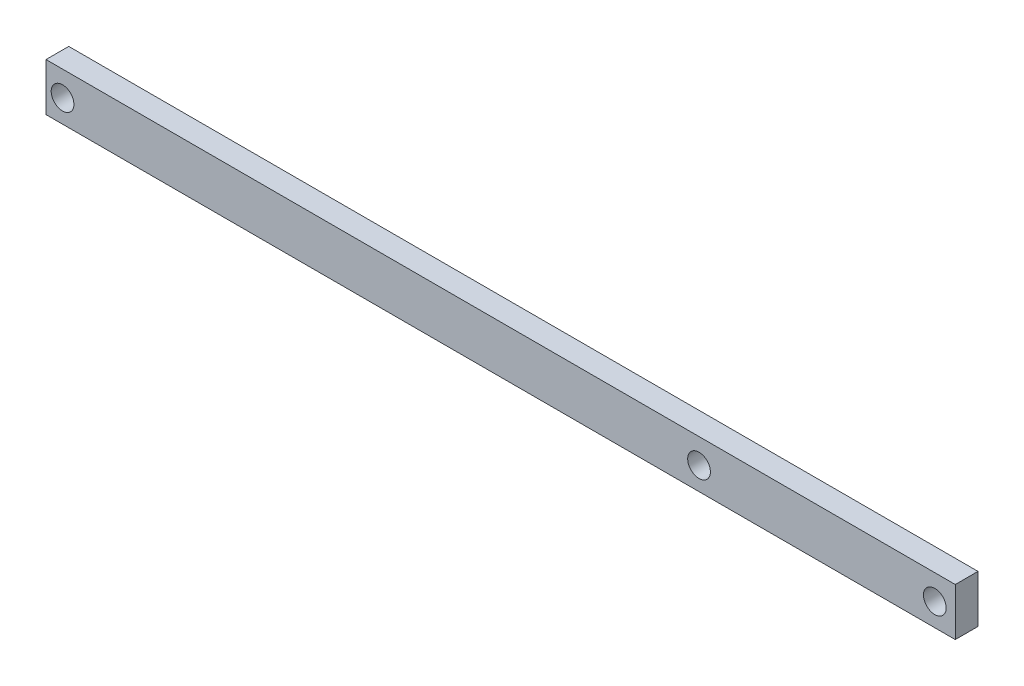
ISO-10303-21;
HEADER;
FILE_DESCRIPTION(('STEP AP214'),'2;1');
FILE_NAME('part.step','',(''),(''),'','','');
FILE_SCHEMA(('AUTOMOTIVE_DESIGN { 1 0 10303 214 1 1 1 1 }'));
ENDSEC;
DATA;
#1=APPLICATION_CONTEXT('core data for automotive mechanical design processes');
#2=APPLICATION_PROTOCOL_DEFINITION('international standard','automotive_design',2000,#1);
#3=PRODUCT_CONTEXT('',#1,'mechanical');
#4=PRODUCT('Part','Part','',(#3));
#5=PRODUCT_RELATED_PRODUCT_CATEGORY('part','',(#4));
#6=PRODUCT_DEFINITION_FORMATION('','',#4);
#7=PRODUCT_DEFINITION_CONTEXT('part definition',#1,'design');
#8=PRODUCT_DEFINITION('design','',#6,#7);
#9=PRODUCT_DEFINITION_SHAPE('','',#8);
#10=(LENGTH_UNIT() NAMED_UNIT(*) SI_UNIT(.MILLI.,.METRE.));
#11=(NAMED_UNIT(*) PLANE_ANGLE_UNIT() SI_UNIT($,.RADIAN.));
#12=(NAMED_UNIT(*) SI_UNIT($,.STERADIAN.) SOLID_ANGLE_UNIT());
#13=UNCERTAINTY_MEASURE_WITH_UNIT(LENGTH_MEASURE(1.E-05),#10,'distance_accuracy_value','');
#14=(GEOMETRIC_REPRESENTATION_CONTEXT(3) GLOBAL_UNCERTAINTY_ASSIGNED_CONTEXT((#13)) GLOBAL_UNIT_ASSIGNED_CONTEXT((#10,
#11,#12)) REPRESENTATION_CONTEXT('',''));
#15=CARTESIAN_POINT('',(0.,0.,0.));
#16=DIRECTION('',(0.,0.,1.));
#17=DIRECTION('',(1.,0.,0.));
#18=AXIS2_PLACEMENT_3D('',#15,#16,#17);
#19=CARTESIAN_POINT('',(0.,0.,10.));
#20=DIRECTION('',(0.,0.,1.));
#21=DIRECTION('',(1.,0.,0.));
#22=AXIS2_PLACEMENT_3D('',#19,#20,#21);
#23=PLANE('',#22);
#24=CARTESIAN_POINT('',(170.979738893048,-2.32108985258689,10.));
#25=DIRECTION('',(0.,0.,1.));
#26=DIRECTION('',(1.,0.,0.));
#27=AXIS2_PLACEMENT_3D('',#24,#25,#26);
#28=CIRCLE('',#27,4.99999999999999);
#29=CARTESIAN_POINT('',(175.979738893048,-2.32108985258689,10.));
#30=VERTEX_POINT('',#29);
#31=EDGE_CURVE('E121',#30,#30,#28,.T.);
#32=ORIENTED_EDGE('',*,*,#31,.F.);
#33=EDGE_LOOP('',(#32));
#34=FACE_BOUND('',#33,.T.);
#35=DIRECTION('',(0.,-1.,0.));
#36=VECTOR('',#35,1.);
#37=CARTESIAN_POINT('',(-116.30017452007,8.65437632415788,10.));
#38=LINE('',#37,#36);
#39=CARTESIAN_POINT('',(-116.30017452007,8.65437632415788,10.));
#40=VERTEX_POINT('',#39);
#41=CARTESIAN_POINT('',(-116.30017452007,-12.3385689354276,10.));
#42=VERTEX_POINT('',#41);
#43=EDGE_CURVE('E91',#40,#42,#38,.T.);
#44=ORIENTED_EDGE('',*,*,#43,.T.);
#45=DIRECTION('',(1.,0.,0.));
#46=VECTOR('',#45,1.);
#47=CARTESIAN_POINT('',(-116.30017452007,-12.3385689354276,10.));
#48=LINE('',#47,#46);
#49=CARTESIAN_POINT('',(283.69982547993,-12.3385689354276,10.));
#50=VERTEX_POINT('',#49);
#51=EDGE_CURVE('E86',#42,#50,#48,.T.);
#52=ORIENTED_EDGE('',*,*,#51,.T.);
#53=DIRECTION('',(0.,1.,0.));
#54=VECTOR('',#53,1.);
#55=CARTESIAN_POINT('',(283.69982547993,8.65437632415788,10.));
#56=LINE('',#55,#54);
#57=CARTESIAN_POINT('',(283.69982547993,8.65437632415788,10.));
#58=VERTEX_POINT('',#57);
#59=EDGE_CURVE('E89',#50,#58,#56,.T.);
#60=ORIENTED_EDGE('',*,*,#59,.T.);
#61=DIRECTION('',(-1.,0.,0.));
#62=VECTOR('',#61,1.);
#63=CARTESIAN_POINT('',(-116.30017452007,8.65437632415788,10.));
#64=LINE('',#63,#62);
#65=EDGE_CURVE('E56',#58,#40,#64,.T.);
#66=ORIENTED_EDGE('',*,*,#65,.T.);
#67=EDGE_LOOP('',(#44,#52,#60,#66));
#68=FACE_BOUND('',#67,.T.);
#69=CARTESIAN_POINT('',(-109.020261095409,-2.31854740466774,10.));
#70=DIRECTION('',(0.,0.,1.));
#71=DIRECTION('',(1.,0.,0.));
#72=AXIS2_PLACEMENT_3D('',#69,#70,#71);
#73=CIRCLE('',#72,5.);
#74=CARTESIAN_POINT('',(-104.020261095409,-2.31854740466774,10.));
#75=VERTEX_POINT('',#74);
#76=EDGE_CURVE('E106',#75,#75,#73,.T.);
#77=ORIENTED_EDGE('',*,*,#76,.F.);
#78=EDGE_LOOP('',(#77));
#79=FACE_BOUND('',#78,.T.);
#80=CARTESIAN_POINT('',(274.704136760598,-2.32108985258689,10.));
#81=DIRECTION('',(0.,0.,1.));
#82=DIRECTION('',(1.,0.,0.));
#83=AXIS2_PLACEMENT_3D('',#80,#81,#82);
#84=CIRCLE('',#83,4.99999999999999);
#85=CARTESIAN_POINT('',(279.704136760598,-2.32108985258689,10.));
#86=VERTEX_POINT('',#85);
#87=EDGE_CURVE('E127',#86,#86,#84,.T.);
#88=ORIENTED_EDGE('',*,*,#87,.F.);
#89=EDGE_LOOP('',(#88));
#90=FACE_BOUND('',#89,.T.);
#91=ADVANCED_FACE('F39',(#34,#68,#79,#90),#23,.T.);
#92=CARTESIAN_POINT('',(0.,0.,0.));
#93=DIRECTION('',(0.,0.,1.));
#94=DIRECTION('',(1.,0.,0.));
#95=AXIS2_PLACEMENT_3D('',#92,#93,#94);
#96=PLANE('',#95);
#97=DIRECTION('',(0.,-1.,0.));
#98=VECTOR('',#97,1.);
#99=CARTESIAN_POINT('',(-116.30017452007,8.65437632415788,0.));
#100=LINE('',#99,#98);
#101=CARTESIAN_POINT('',(-116.30017452007,8.65437632415788,0.));
#102=VERTEX_POINT('',#101);
#103=CARTESIAN_POINT('',(-116.30017452007,-12.3385689354276,0.));
#104=VERTEX_POINT('',#103);
#105=EDGE_CURVE('E103',#102,#104,#100,.T.);
#106=ORIENTED_EDGE('',*,*,#105,.F.);
#107=DIRECTION('',(-1.,0.,0.));
#108=VECTOR('',#107,1.);
#109=CARTESIAN_POINT('',(-116.30017452007,8.65437632415788,0.));
#110=LINE('',#109,#108);
#111=CARTESIAN_POINT('',(283.69982547993,8.65437632415788,0.));
#112=VERTEX_POINT('',#111);
#113=EDGE_CURVE('E79',#112,#102,#110,.T.);
#114=ORIENTED_EDGE('',*,*,#113,.F.);
#115=DIRECTION('',(0.,1.,0.));
#116=VECTOR('',#115,1.);
#117=CARTESIAN_POINT('',(283.69982547993,8.65437632415788,0.));
#118=LINE('',#117,#116);
#119=CARTESIAN_POINT('',(283.69982547993,-12.3385689354276,0.));
#120=VERTEX_POINT('',#119);
#121=EDGE_CURVE('E73',#120,#112,#118,.T.);
#122=ORIENTED_EDGE('',*,*,#121,.F.);
#123=DIRECTION('',(1.,0.,0.));
#124=VECTOR('',#123,1.);
#125=CARTESIAN_POINT('',(-116.30017452007,-12.3385689354276,0.));
#126=LINE('',#125,#124);
#127=EDGE_CURVE('E95',#104,#120,#126,.T.);
#128=ORIENTED_EDGE('',*,*,#127,.F.);
#129=EDGE_LOOP('',(#106,#114,#122,#128));
#130=FACE_BOUND('',#129,.T.);
#131=CARTESIAN_POINT('',(-109.020261095409,-2.31854740466774,0.));
#132=DIRECTION('',(0.,0.,1.));
#133=DIRECTION('',(1.,0.,0.));
#134=AXIS2_PLACEMENT_3D('',#131,#132,#133);
#135=CIRCLE('',#134,5.);
#136=CARTESIAN_POINT('',(-104.020261095409,-2.31854740466774,0.));
#137=VERTEX_POINT('',#136);
#138=EDGE_CURVE('E118',#137,#137,#135,.T.);
#139=ORIENTED_EDGE('',*,*,#138,.T.);
#140=EDGE_LOOP('',(#139));
#141=FACE_BOUND('',#140,.T.);
#142=CARTESIAN_POINT('',(170.979738893048,-2.32108985258689,0.));
#143=DIRECTION('',(0.,0.,1.));
#144=DIRECTION('',(1.,0.,0.));
#145=AXIS2_PLACEMENT_3D('',#142,#143,#144);
#146=CIRCLE('',#145,4.99999999999999);
#147=CARTESIAN_POINT('',(175.979738893048,-2.32108985258689,0.));
#148=VERTEX_POINT('',#147);
#149=EDGE_CURVE('E124',#148,#148,#146,.T.);
#150=ORIENTED_EDGE('',*,*,#149,.T.);
#151=EDGE_LOOP('',(#150));
#152=FACE_BOUND('',#151,.T.);
#153=CARTESIAN_POINT('',(274.704136760598,-2.32108985258689,0.));
#154=DIRECTION('',(0.,0.,1.));
#155=DIRECTION('',(1.,0.,0.));
#156=AXIS2_PLACEMENT_3D('',#153,#154,#155);
#157=CIRCLE('',#156,4.99999999999999);
#158=CARTESIAN_POINT('',(279.704136760598,-2.32108985258689,0.));
#159=VERTEX_POINT('',#158);
#160=EDGE_CURVE('E130',#159,#159,#157,.T.);
#161=ORIENTED_EDGE('',*,*,#160,.T.);
#162=EDGE_LOOP('',(#161));
#163=FACE_BOUND('',#162,.T.);
#164=ADVANCED_FACE('F114',(#130,#141,#152,#163),#96,.F.);
#165=CARTESIAN_POINT('',(-116.30017452007,8.65437632415788,10.));
#166=DIRECTION('',(1.,0.,0.));
#167=DIRECTION('',(0.,0.,-1.));
#168=AXIS2_PLACEMENT_3D('',#165,#166,#167);
#169=PLANE('',#168);
#170=ORIENTED_EDGE('',*,*,#105,.T.);
#171=DIRECTION('',(0.,0.,-1.));
#172=VECTOR('',#171,1.);
#173=CARTESIAN_POINT('',(-116.30017452007,-12.3385689354276,10.));
#174=LINE('',#173,#172);
#175=EDGE_CURVE('E11',#42,#104,#174,.T.);
#176=ORIENTED_EDGE('',*,*,#175,.F.);
#177=ORIENTED_EDGE('',*,*,#43,.F.);
#178=DIRECTION('',(0.,0.,-1.));
#179=VECTOR('',#178,1.);
#180=CARTESIAN_POINT('',(-116.30017452007,8.65437632415788,10.));
#181=LINE('',#180,#179);
#182=EDGE_CURVE('E99',#40,#102,#181,.T.);
#183=ORIENTED_EDGE('',*,*,#182,.T.);
#184=EDGE_LOOP('',(#170,#176,#177,#183));
#185=FACE_BOUND('',#184,.T.);
#186=ADVANCED_FACE('F41',(#185),#169,.F.);
#187=CARTESIAN_POINT('',(-116.30017452007,-12.3385689354276,10.));
#188=DIRECTION('',(0.,1.,0.));
#189=DIRECTION('',(0.,0.,1.));
#190=AXIS2_PLACEMENT_3D('',#187,#188,#189);
#191=PLANE('',#190);
#192=ORIENTED_EDGE('',*,*,#127,.T.);
#193=DIRECTION('',(0.,0.,-1.));
#194=VECTOR('',#193,1.);
#195=CARTESIAN_POINT('',(283.69982547993,-12.3385689354276,10.));
#196=LINE('',#195,#194);
#197=EDGE_CURVE('E48',#50,#120,#196,.T.);
#198=ORIENTED_EDGE('',*,*,#197,.F.);
#199=ORIENTED_EDGE('',*,*,#51,.F.);
#200=ORIENTED_EDGE('',*,*,#175,.T.);
#201=EDGE_LOOP('',(#192,#198,#199,#200));
#202=FACE_BOUND('',#201,.T.);
#203=ADVANCED_FACE('F94',(#202),#191,.F.);
#204=CARTESIAN_POINT('',(283.69982547993,8.65437632415788,10.));
#205=DIRECTION('',(-1.,0.,0.));
#206=DIRECTION('',(0.,0.,1.));
#207=AXIS2_PLACEMENT_3D('',#204,#205,#206);
#208=PLANE('',#207);
#209=ORIENTED_EDGE('',*,*,#121,.T.);
#210=DIRECTION('',(0.,0.,-1.));
#211=VECTOR('',#210,1.);
#212=CARTESIAN_POINT('',(283.69982547993,8.65437632415788,10.));
#213=LINE('',#212,#211);
#214=EDGE_CURVE('E96',#58,#112,#213,.T.);
#215=ORIENTED_EDGE('',*,*,#214,.F.);
#216=ORIENTED_EDGE('',*,*,#59,.F.);
#217=ORIENTED_EDGE('',*,*,#197,.T.);
#218=EDGE_LOOP('',(#209,#215,#216,#217));
#219=FACE_BOUND('',#218,.T.);
#220=ADVANCED_FACE('F97',(#219),#208,.F.);
#221=CARTESIAN_POINT('',(-116.30017452007,8.65437632415788,10.));
#222=DIRECTION('',(0.,-1.,0.));
#223=DIRECTION('',(0.,0.,-1.));
#224=AXIS2_PLACEMENT_3D('',#221,#222,#223);
#225=PLANE('',#224);
#226=ORIENTED_EDGE('',*,*,#113,.T.);
#227=ORIENTED_EDGE('',*,*,#182,.F.);
#228=ORIENTED_EDGE('',*,*,#65,.F.);
#229=ORIENTED_EDGE('',*,*,#214,.T.);
#230=EDGE_LOOP('',(#226,#227,#228,#229));
#231=FACE_BOUND('',#230,.T.);
#232=ADVANCED_FACE('F111',(#231),#225,.F.);
#233=CARTESIAN_POINT('',(-109.020261095409,-2.31854740466774,10.));
#234=DIRECTION('',(0.,0.,-1.));
#235=DIRECTION('',(-1.,0.,0.));
#236=AXIS2_PLACEMENT_3D('',#233,#234,#235);
#237=CYLINDRICAL_SURFACE('',#236,5.);
#238=ORIENTED_EDGE('',*,*,#76,.T.);
#239=EDGE_LOOP('',(#238));
#240=FACE_BOUND('',#239,.T.);
#241=ORIENTED_EDGE('',*,*,#138,.F.);
#242=EDGE_LOOP('',(#241));
#243=FACE_BOUND('',#242,.T.);
#244=ADVANCED_FACE('F148',(#240,#243),#237,.F.);
#245=CARTESIAN_POINT('',(170.979738893048,-2.32108985258689,10.));
#246=DIRECTION('',(0.,0.,-1.));
#247=DIRECTION('',(-1.,0.,0.));
#248=AXIS2_PLACEMENT_3D('',#245,#246,#247);
#249=CYLINDRICAL_SURFACE('',#248,4.99999999999999);
#250=ORIENTED_EDGE('',*,*,#31,.T.);
#251=EDGE_LOOP('',(#250));
#252=FACE_BOUND('',#251,.T.);
#253=ORIENTED_EDGE('',*,*,#149,.F.);
#254=EDGE_LOOP('',(#253));
#255=FACE_BOUND('',#254,.T.);
#256=ADVANCED_FACE('F193',(#252,#255),#249,.F.);
#257=CARTESIAN_POINT('',(274.704136760598,-2.32108985258689,10.));
#258=DIRECTION('',(0.,0.,-1.));
#259=DIRECTION('',(-1.,0.,0.));
#260=AXIS2_PLACEMENT_3D('',#257,#258,#259);
#261=CYLINDRICAL_SURFACE('',#260,4.99999999999999);
#262=ORIENTED_EDGE('',*,*,#87,.T.);
#263=EDGE_LOOP('',(#262));
#264=FACE_BOUND('',#263,.T.);
#265=ORIENTED_EDGE('',*,*,#160,.F.);
#266=EDGE_LOOP('',(#265));
#267=FACE_BOUND('',#266,.T.);
#268=ADVANCED_FACE('F136',(#264,#267),#261,.F.);
#269=CLOSED_SHELL('',(#91,#164,#186,#203,#220,#232,#244,#256,#268));
#270=MANIFOLD_SOLID_BREP('B2',#269);
#271=ADVANCED_BREP_SHAPE_REPRESENTATION('',(#18,#270),#14);
#272=SHAPE_DEFINITION_REPRESENTATION(#9,#271);
ENDSEC;
END-ISO-10303-21;
